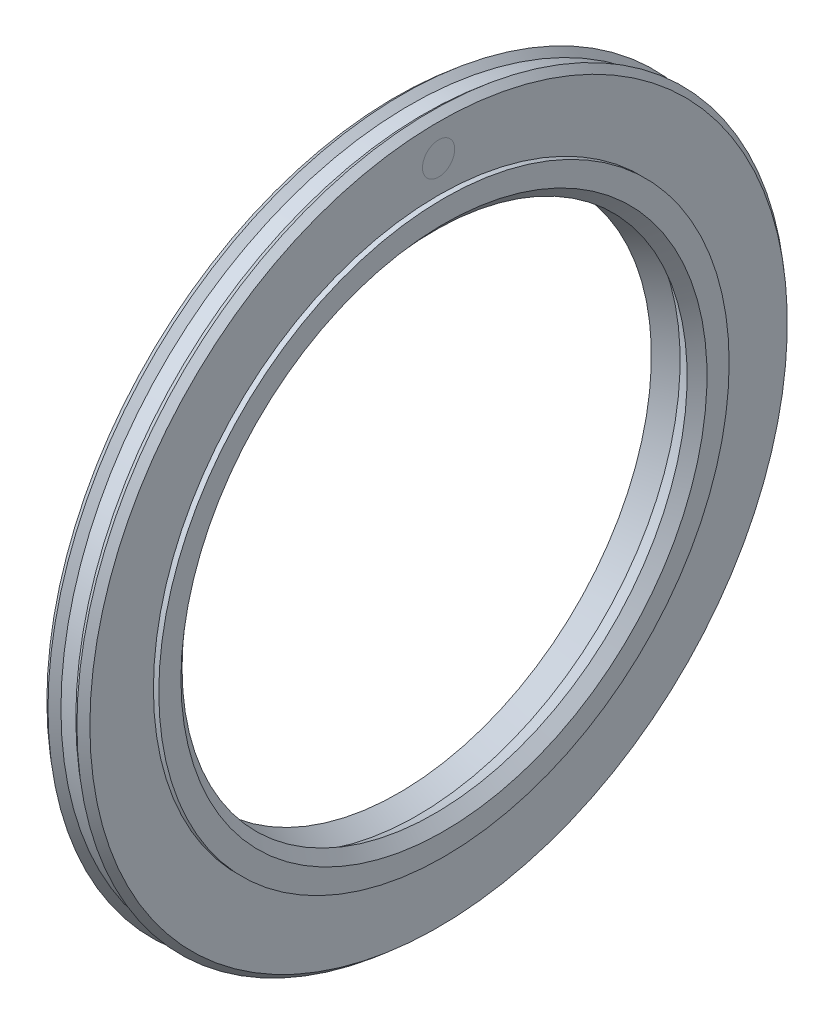
ISO-10303-21;
HEADER;
FILE_DESCRIPTION(('STEP AP214'),'2;1');
FILE_NAME('part.step','',(''),(''),'','','');
FILE_SCHEMA(('AUTOMOTIVE_DESIGN { 1 0 10303 214 1 1 1 1 }'));
ENDSEC;
DATA;
#1=APPLICATION_CONTEXT('core data for automotive mechanical design processes');
#2=APPLICATION_PROTOCOL_DEFINITION('international standard','automotive_design',2000,#1);
#3=PRODUCT_CONTEXT('',#1,'mechanical');
#4=PRODUCT('Part','Part','',(#3));
#5=PRODUCT_RELATED_PRODUCT_CATEGORY('part','',(#4));
#6=PRODUCT_DEFINITION_FORMATION('','',#4);
#7=PRODUCT_DEFINITION_CONTEXT('part definition',#1,'design');
#8=PRODUCT_DEFINITION('design','',#6,#7);
#9=PRODUCT_DEFINITION_SHAPE('','',#8);
#10=(LENGTH_UNIT() NAMED_UNIT(*) SI_UNIT(.MILLI.,.METRE.));
#11=(NAMED_UNIT(*) PLANE_ANGLE_UNIT() SI_UNIT($,.RADIAN.));
#12=(NAMED_UNIT(*) SI_UNIT($,.STERADIAN.) SOLID_ANGLE_UNIT());
#13=UNCERTAINTY_MEASURE_WITH_UNIT(LENGTH_MEASURE(1.E-05),#10,'distance_accuracy_value','');
#14=(GEOMETRIC_REPRESENTATION_CONTEXT(3) GLOBAL_UNCERTAINTY_ASSIGNED_CONTEXT((#13)) GLOBAL_UNIT_ASSIGNED_CONTEXT((#10,
#11,#12)) REPRESENTATION_CONTEXT('',''));
#15=CARTESIAN_POINT('',(0.,0.,0.));
#16=DIRECTION('',(0.,0.,1.));
#17=DIRECTION('',(1.,0.,0.));
#18=AXIS2_PLACEMENT_3D('',#15,#16,#17);
#19=CARTESIAN_POINT('',(4.,32.4496568426294,0.));
#20=DIRECTION('',(-1.,0.,0.));
#21=DIRECTION('',(0.,0.,1.));
#22=AXIS2_PLACEMENT_3D('',#19,#20,#21);
#23=PLANE('',#22);
#24=CARTESIAN_POINT('',(4.,0.,0.));
#25=DIRECTION('',(-1.,0.,0.));
#26=DIRECTION('',(0.,0.,1.));
#27=AXIS2_PLACEMENT_3D('',#24,#25,#26);
#28=CIRCLE('',#27,26.537069046427);
#29=CARTESIAN_POINT('',(4.,0.,26.537069046427));
#30=VERTEX_POINT('',#29);
#31=EDGE_CURVE('E58',#30,#30,#28,.T.);
#32=ORIENTED_EDGE('',*,*,#31,.T.);
#33=EDGE_LOOP('',(#32));
#34=FACE_BOUND('',#33,.T.);
#35=CARTESIAN_POINT('',(4.,0.,0.));
#36=DIRECTION('',(-1.,0.,0.));
#37=DIRECTION('',(0.,0.,1.));
#38=AXIS2_PLACEMENT_3D('',#35,#36,#37);
#39=CIRCLE('',#38,32.4496568426294);
#40=CARTESIAN_POINT('',(4.,0.,32.4496568426294));
#41=VERTEX_POINT('',#40);
#42=EDGE_CURVE('E53',#41,#41,#39,.T.);
#43=ORIENTED_EDGE('',*,*,#42,.F.);
#44=EDGE_LOOP('',(#43));
#45=FACE_BOUND('',#44,.T.);
#46=CARTESIAN_POINT('',(4.,29.4907454905403,0.));
#47=DIRECTION('',(-1.,0.,0.));
#48=DIRECTION('',(0.,0.,1.));
#49=AXIS2_PLACEMENT_3D('',#46,#47,#48);
#50=CIRCLE('',#49,1.5);
#51=CARTESIAN_POINT('',(4.,29.4907454905403,1.5));
#52=VERTEX_POINT('',#51);
#53=EDGE_CURVE('E10',#52,#52,#50,.F.);
#54=ORIENTED_EDGE('',*,*,#53,.F.);
#55=EDGE_LOOP('',(#54));
#56=FACE_BOUND('',#55,.T.);
#57=ADVANCED_FACE('F35',(#34,#45,#56),#23,.F.);
#58=CARTESIAN_POINT('',(0.,0.,0.));
#59=DIRECTION('',(-1.,0.,0.));
#60=DIRECTION('',(0.,0.,1.));
#61=AXIS2_PLACEMENT_3D('',#58,#59,#60);
#62=CYLINDRICAL_SURFACE('',#61,32.4496568426294);
#63=CARTESIAN_POINT('',(1.30757115753417,0.,0.));
#64=DIRECTION('',(-1.,0.,0.));
#65=DIRECTION('',(0.,0.,1.));
#66=AXIS2_PLACEMENT_3D('',#63,#64,#65);
#67=CIRCLE('',#66,32.4496568426294);
#68=CARTESIAN_POINT('',(1.30757115753417,0.,32.4496568426294));
#69=VERTEX_POINT('',#68);
#70=EDGE_CURVE('E91',#69,#69,#67,.T.);
#71=ORIENTED_EDGE('',*,*,#70,.F.);
#72=EDGE_LOOP('',(#71));
#73=FACE_BOUND('',#72,.T.);
#74=CARTESIAN_POINT('',(2.69242884246583,0.,0.));
#75=DIRECTION('',(-1.,0.,0.));
#76=DIRECTION('',(0.,0.,1.));
#77=AXIS2_PLACEMENT_3D('',#74,#75,#76);
#78=CIRCLE('',#77,32.4496568426294);
#79=CARTESIAN_POINT('',(2.69242884246583,0.,32.4496568426294));
#80=VERTEX_POINT('',#79);
#81=EDGE_CURVE('E43',#80,#80,#78,.T.);
#82=ORIENTED_EDGE('',*,*,#81,.T.);
#83=EDGE_LOOP('',(#82));
#84=FACE_BOUND('',#83,.T.);
#85=ADVANCED_FACE('F37',(#73,#84),#62,.T.);
#86=CARTESIAN_POINT('',(3.34621442123292,0.,0.));
#87=DIRECTION('',(1.,0.,0.));
#88=DIRECTION('',(0.,0.,-1.));
#89=AXIS2_PLACEMENT_3D('',#86,#87,#88);
#90=CONICAL_SURFACE('',#89,33.,0.69970211310127);
#91=ORIENTED_EDGE('',*,*,#81,.F.);
#92=EDGE_LOOP('',(#91));
#93=FACE_BOUND('',#92,.T.);
#94=CARTESIAN_POINT('',(3.34621442123292,0.,0.));
#95=DIRECTION('',(-1.,0.,0.));
#96=DIRECTION('',(0.,0.,1.));
#97=AXIS2_PLACEMENT_3D('',#94,#95,#96);
#98=CIRCLE('',#97,33.);
#99=CARTESIAN_POINT('',(3.34621442123292,0.,33.));
#100=VERTEX_POINT('',#99);
#101=EDGE_CURVE('E49',#100,#100,#98,.T.);
#102=ORIENTED_EDGE('',*,*,#101,.T.);
#103=EDGE_LOOP('',(#102));
#104=FACE_BOUND('',#103,.T.);
#105=ADVANCED_FACE('F182',(#93,#104),#90,.T.);
#106=CARTESIAN_POINT('',(4.,0.,0.));
#107=DIRECTION('',(-1.,0.,0.));
#108=DIRECTION('',(0.,0.,1.));
#109=AXIS2_PLACEMENT_3D('',#106,#107,#108);
#110=CONICAL_SURFACE('',#109,32.4496568426294,0.69970211310127);
#111=ORIENTED_EDGE('',*,*,#101,.F.);
#112=EDGE_LOOP('',(#111));
#113=FACE_BOUND('',#112,.T.);
#114=ORIENTED_EDGE('',*,*,#42,.T.);
#115=EDGE_LOOP('',(#114));
#116=FACE_BOUND('',#115,.T.);
#117=ADVANCED_FACE('F187',(#113,#116),#110,.T.);
#118=ORIENTED_EDGE('',*,*,#53,.T.);
#119=EDGE_LOOP('',(#118));
#120=FACE_BOUND('',#119,.T.);
#121=ADVANCED_FACE('F191',(#120),#23,.F.);
#122=CARTESIAN_POINT('',(0.,0.,0.));
#123=DIRECTION('',(-1.,0.,0.));
#124=DIRECTION('',(0.,0.,1.));
#125=AXIS2_PLACEMENT_3D('',#122,#123,#124);
#126=CYLINDRICAL_SURFACE('',#125,26.537069046427);
#127=ORIENTED_EDGE('',*,*,#31,.F.);
#128=EDGE_LOOP('',(#127));
#129=FACE_BOUND('',#128,.T.);
#130=CARTESIAN_POINT('',(4.5,0.,0.));
#131=DIRECTION('',(-1.,0.,0.));
#132=DIRECTION('',(0.,0.,1.));
#133=AXIS2_PLACEMENT_3D('',#130,#131,#132);
#134=CIRCLE('',#133,26.537069046427);
#135=CARTESIAN_POINT('',(4.5,0.,26.537069046427));
#136=VERTEX_POINT('',#135);
#137=EDGE_CURVE('E61',#136,#136,#134,.T.);
#138=ORIENTED_EDGE('',*,*,#137,.T.);
#139=EDGE_LOOP('',(#138));
#140=FACE_BOUND('',#139,.T.);
#141=ADVANCED_FACE('F198',(#129,#140),#126,.T.);
#142=CARTESIAN_POINT('',(4.5,26.537069046427,0.));
#143=DIRECTION('',(-1.,0.,0.));
#144=DIRECTION('',(0.,0.,1.));
#145=AXIS2_PLACEMENT_3D('',#142,#143,#144);
#146=PLANE('',#145);
#147=ORIENTED_EDGE('',*,*,#137,.F.);
#148=EDGE_LOOP('',(#147));
#149=FACE_BOUND('',#148,.T.);
#150=CARTESIAN_POINT('',(4.49999999999998,0.,0.));
#151=DIRECTION('',(-1.,0.,0.));
#152=DIRECTION('',(0.,0.,1.));
#153=AXIS2_PLACEMENT_3D('',#150,#151,#152);
#154=CIRCLE('',#153,24.4758342190069);
#155=CARTESIAN_POINT('',(4.49999999999998,0.,24.4758342190069));
#156=VERTEX_POINT('',#155);
#157=EDGE_CURVE('E64',#156,#156,#154,.T.);
#158=ORIENTED_EDGE('',*,*,#157,.T.);
#159=EDGE_LOOP('',(#158));
#160=FACE_BOUND('',#159,.T.);
#161=ADVANCED_FACE('F203',(#149,#160),#146,.F.);
#162=CARTESIAN_POINT('',(3.62774938475749,0.,0.));
#163=DIRECTION('',(1.,0.,0.));
#164=DIRECTION('',(0.,0.,-1.));
#165=AXIS2_PLACEMENT_3D('',#162,#163,#164);
#166=CONICAL_SURFACE('',#165,23.5,0.841388741457786);
#167=ORIENTED_EDGE('',*,*,#157,.F.);
#168=EDGE_LOOP('',(#167));
#169=FACE_BOUND('',#168,.T.);
#170=CARTESIAN_POINT('',(3.62774938475749,0.,0.));
#171=DIRECTION('',(-1.,0.,0.));
#172=DIRECTION('',(0.,0.,1.));
#173=AXIS2_PLACEMENT_3D('',#170,#171,#172);
#174=CIRCLE('',#173,23.5);
#175=CARTESIAN_POINT('',(3.62774938475749,0.,23.5));
#176=VERTEX_POINT('',#175);
#177=EDGE_CURVE('E67',#176,#176,#174,.T.);
#178=ORIENTED_EDGE('',*,*,#177,.T.);
#179=EDGE_LOOP('',(#178));
#180=FACE_BOUND('',#179,.T.);
#181=ADVANCED_FACE('F254',(#169,#180),#166,.F.);
#182=CARTESIAN_POINT('',(2.,0.,0.));
#183=DIRECTION('',(-1.,0.,0.));
#184=DIRECTION('',(0.,0.,1.));
#185=AXIS2_PLACEMENT_3D('',#182,#183,#184);
#186=CONICAL_SURFACE('',#185,24.4758342190068,0.540051077434647);
#187=ORIENTED_EDGE('',*,*,#177,.F.);
#188=EDGE_LOOP('',(#187));
#189=FACE_BOUND('',#188,.T.);
#190=CARTESIAN_POINT('',(2.,0.,0.));
#191=DIRECTION('',(-1.,0.,0.));
#192=DIRECTION('',(0.,0.,1.));
#193=AXIS2_PLACEMENT_3D('',#190,#191,#192);
#194=CIRCLE('',#193,24.4758342190068);
#195=CARTESIAN_POINT('',(2.,0.,24.4758342190068));
#196=VERTEX_POINT('',#195);
#197=EDGE_CURVE('E70',#196,#196,#194,.T.);
#198=ORIENTED_EDGE('',*,*,#197,.T.);
#199=EDGE_LOOP('',(#198));
#200=FACE_BOUND('',#199,.T.);
#201=ADVANCED_FACE('F263',(#189,#200),#186,.F.);
#202=CARTESIAN_POINT('',(0.300000000000004,0.,0.));
#203=DIRECTION('',(1.,0.,0.));
#204=DIRECTION('',(0.,0.,-1.));
#205=AXIS2_PLACEMENT_3D('',#202,#203,#204);
#206=CONICAL_SURFACE('',#205,23.5,0.521097568812261);
#207=ORIENTED_EDGE('',*,*,#197,.F.);
#208=EDGE_LOOP('',(#207));
#209=FACE_BOUND('',#208,.T.);
#210=CARTESIAN_POINT('',(0.300000000000004,0.,0.));
#211=DIRECTION('',(-1.,0.,0.));
#212=DIRECTION('',(0.,0.,1.));
#213=AXIS2_PLACEMENT_3D('',#210,#211,#212);
#214=CIRCLE('',#213,23.5);
#215=CARTESIAN_POINT('',(0.300000000000004,0.,23.5));
#216=VERTEX_POINT('',#215);
#217=EDGE_CURVE('E73',#216,#216,#214,.T.);
#218=ORIENTED_EDGE('',*,*,#217,.T.);
#219=EDGE_LOOP('',(#218));
#220=FACE_BOUND('',#219,.T.);
#221=ADVANCED_FACE('F272',(#209,#220),#206,.F.);
#222=CARTESIAN_POINT('',(0.500000000000004,0.,0.));
#223=DIRECTION('',(1.,0.,0.));
#224=DIRECTION('',(0.,0.,-1.));
#225=AXIS2_PLACEMENT_3D('',#222,#223,#224);
#226=CONICAL_SURFACE('',#225,24.7933582657414,1.41737531661641);
#227=ORIENTED_EDGE('',*,*,#217,.F.);
#228=EDGE_LOOP('',(#227));
#229=FACE_BOUND('',#228,.T.);
#230=CARTESIAN_POINT('',(0.500000000000004,0.,0.));
#231=DIRECTION('',(-1.,0.,0.));
#232=DIRECTION('',(0.,0.,1.));
#233=AXIS2_PLACEMENT_3D('',#230,#231,#232);
#234=CIRCLE('',#233,24.7933582657414);
#235=CARTESIAN_POINT('',(0.500000000000004,0.,24.7933582657414));
#236=VERTEX_POINT('',#235);
#237=EDGE_CURVE('E76',#236,#236,#234,.T.);
#238=ORIENTED_EDGE('',*,*,#237,.T.);
#239=EDGE_LOOP('',(#238));
#240=FACE_BOUND('',#239,.T.);
#241=ADVANCED_FACE('F281',(#229,#240),#226,.T.);
#242=CARTESIAN_POINT('',(0.500000000000004,26.537069046427,0.));
#243=DIRECTION('',(1.,0.,0.));
#244=DIRECTION('',(0.,0.,-1.));
#245=AXIS2_PLACEMENT_3D('',#242,#243,#244);
#246=PLANE('',#245);
#247=ORIENTED_EDGE('',*,*,#237,.F.);
#248=EDGE_LOOP('',(#247));
#249=FACE_BOUND('',#248,.T.);
#250=CARTESIAN_POINT('',(0.500000000000004,0.,0.));
#251=DIRECTION('',(-1.,0.,0.));
#252=DIRECTION('',(0.,0.,1.));
#253=AXIS2_PLACEMENT_3D('',#250,#251,#252);
#254=CIRCLE('',#253,26.537069046427);
#255=CARTESIAN_POINT('',(0.500000000000004,0.,26.537069046427));
#256=VERTEX_POINT('',#255);
#257=EDGE_CURVE('E79',#256,#256,#254,.T.);
#258=ORIENTED_EDGE('',*,*,#257,.T.);
#259=EDGE_LOOP('',(#258));
#260=FACE_BOUND('',#259,.T.);
#261=ADVANCED_FACE('F290',(#249,#260),#246,.F.);
#262=CARTESIAN_POINT('',(0.,0.,0.));
#263=DIRECTION('',(-1.,0.,0.));
#264=DIRECTION('',(0.,0.,1.));
#265=AXIS2_PLACEMENT_3D('',#262,#263,#264);
#266=CYLINDRICAL_SURFACE('',#265,26.537069046427);
#267=ORIENTED_EDGE('',*,*,#257,.F.);
#268=EDGE_LOOP('',(#267));
#269=FACE_BOUND('',#268,.T.);
#270=CARTESIAN_POINT('',(0.,0.,0.));
#271=DIRECTION('',(-1.,0.,0.));
#272=DIRECTION('',(0.,0.,1.));
#273=AXIS2_PLACEMENT_3D('',#270,#271,#272);
#274=CIRCLE('',#273,26.537069046427);
#275=CARTESIAN_POINT('',(0.,0.,26.537069046427));
#276=VERTEX_POINT('',#275);
#277=EDGE_CURVE('E82',#276,#276,#274,.T.);
#278=ORIENTED_EDGE('',*,*,#277,.T.);
#279=EDGE_LOOP('',(#278));
#280=FACE_BOUND('',#279,.T.);
#281=ADVANCED_FACE('F149',(#269,#280),#266,.F.);
#282=CARTESIAN_POINT('',(0.,32.4496568426294,0.));
#283=DIRECTION('',(1.,0.,0.));
#284=DIRECTION('',(0.,0.,-1.));
#285=AXIS2_PLACEMENT_3D('',#282,#283,#284);
#286=PLANE('',#285);
#287=CARTESIAN_POINT('',(0.,0.,28.));
#288=DIRECTION('',(-1.,0.,0.));
#289=DIRECTION('',(0.,0.,1.));
#290=AXIS2_PLACEMENT_3D('',#287,#288,#289);
#291=CIRCLE('',#290,0.499999999999999);
#292=CARTESIAN_POINT('',(0.,0.,28.5));
#293=VERTEX_POINT('',#292);
#294=EDGE_CURVE('E139',#293,#293,#291,.T.);
#295=ORIENTED_EDGE('',*,*,#294,.F.);
#296=EDGE_LOOP('',(#295));
#297=FACE_BOUND('',#296,.T.);
#298=CARTESIAN_POINT('',(0.,0.,31.));
#299=DIRECTION('',(-1.,0.,0.));
#300=DIRECTION('',(0.,0.,1.));
#301=AXIS2_PLACEMENT_3D('',#298,#299,#300);
#302=CIRCLE('',#301,0.499999999999999);
#303=CARTESIAN_POINT('',(0.,0.,31.5));
#304=VERTEX_POINT('',#303);
#305=EDGE_CURVE('E133',#304,#304,#302,.T.);
#306=ORIENTED_EDGE('',*,*,#305,.F.);
#307=EDGE_LOOP('',(#306));
#308=FACE_BOUND('',#307,.T.);
#309=CARTESIAN_POINT('',(0.,14.7500000000003,-25.5477494116408));
#310=DIRECTION('',(-1.,0.,0.));
#311=DIRECTION('',(0.,0.866025403784433,0.50000000000001));
#312=AXIS2_PLACEMENT_3D('',#309,#310,#311);
#313=CIRCLE('',#312,1.);
#314=CARTESIAN_POINT('',(0.,15.6160254037847,-25.0477494116408));
#315=VERTEX_POINT('',#314);
#316=EDGE_CURVE('E127',#315,#315,#313,.T.);
#317=ORIENTED_EDGE('',*,*,#316,.F.);
#318=EDGE_LOOP('',(#317));
#319=FACE_BOUND('',#318,.T.);
#320=CARTESIAN_POINT('',(0.,-14.7499999999998,-25.5477494116411));
#321=DIRECTION('',(-1.,0.,0.));
#322=DIRECTION('',(0.,0.866025403784443,-0.499999999999992));
#323=AXIS2_PLACEMENT_3D('',#320,#321,#322);
#324=CIRCLE('',#323,1.);
#325=CARTESIAN_POINT('',(0.,-13.8839745962153,-26.0477494116411));
#326=VERTEX_POINT('',#325);
#327=EDGE_CURVE('E121',#326,#326,#324,.T.);
#328=ORIENTED_EDGE('',*,*,#327,.F.);
#329=EDGE_LOOP('',(#328));
#330=FACE_BOUND('',#329,.T.);
#331=CARTESIAN_POINT('',(0.,-29.5,-2.05997518305454E-13));
#332=DIRECTION('',(-1.,0.,0.));
#333=DIRECTION('',(0.,0.,-1.));
#334=AXIS2_PLACEMENT_3D('',#331,#332,#333);
#335=CIRCLE('',#334,1.);
#336=CARTESIAN_POINT('',(0.,-29.5,-1.00000000000021));
#337=VERTEX_POINT('',#336);
#338=EDGE_CURVE('E115',#337,#337,#335,.T.);
#339=ORIENTED_EDGE('',*,*,#338,.F.);
#340=EDGE_LOOP('',(#339));
#341=FACE_BOUND('',#340,.T.);
#342=CARTESIAN_POINT('',(0.,-14.7500000000001,25.5477494116409));
#343=DIRECTION('',(-1.,0.,0.));
#344=DIRECTION('',(0.,-0.866025403784436,-0.500000000000004));
#345=AXIS2_PLACEMENT_3D('',#342,#343,#344);
#346=CIRCLE('',#345,1.);
#347=CARTESIAN_POINT('',(0.,-15.6160254037846,25.0477494116409));
#348=VERTEX_POINT('',#347);
#349=EDGE_CURVE('E109',#348,#348,#346,.T.);
#350=ORIENTED_EDGE('',*,*,#349,.F.);
#351=EDGE_LOOP('',(#350));
#352=FACE_BOUND('',#351,.T.);
#353=CARTESIAN_POINT('',(0.,14.7499999999999,25.547749411641));
#354=DIRECTION('',(-1.,0.,0.));
#355=DIRECTION('',(0.,-0.86602540378444,0.499999999999998));
#356=AXIS2_PLACEMENT_3D('',#353,#354,#355);
#357=CIRCLE('',#356,1.);
#358=CARTESIAN_POINT('',(0.,13.8839745962155,26.047749411641));
#359=VERTEX_POINT('',#358);
#360=EDGE_CURVE('E103',#359,#359,#357,.T.);
#361=ORIENTED_EDGE('',*,*,#360,.F.);
#362=EDGE_LOOP('',(#361));
#363=FACE_BOUND('',#362,.T.);
#364=CARTESIAN_POINT('',(0.,29.5,0.));
#365=DIRECTION('',(-1.,0.,0.));
#366=DIRECTION('',(0.,0.,1.));
#367=AXIS2_PLACEMENT_3D('',#364,#365,#366);
#368=CIRCLE('',#367,1.);
#369=CARTESIAN_POINT('',(0.,29.5,1.));
#370=VERTEX_POINT('',#369);
#371=EDGE_CURVE('E97',#370,#370,#368,.T.);
#372=ORIENTED_EDGE('',*,*,#371,.F.);
#373=EDGE_LOOP('',(#372));
#374=FACE_BOUND('',#373,.T.);
#375=ORIENTED_EDGE('',*,*,#277,.F.);
#376=EDGE_LOOP('',(#375));
#377=FACE_BOUND('',#376,.T.);
#378=CARTESIAN_POINT('',(0.,0.,0.));
#379=DIRECTION('',(-1.,0.,0.));
#380=DIRECTION('',(0.,0.,1.));
#381=AXIS2_PLACEMENT_3D('',#378,#379,#380);
#382=CIRCLE('',#381,32.4496568426294);
#383=CARTESIAN_POINT('',(0.,0.,32.4496568426294));
#384=VERTEX_POINT('',#383);
#385=EDGE_CURVE('E85',#384,#384,#382,.T.);
#386=ORIENTED_EDGE('',*,*,#385,.T.);
#387=EDGE_LOOP('',(#386));
#388=FACE_BOUND('',#387,.T.);
#389=ADVANCED_FACE('F145',(#297,#308,#319,#330,#341,#352,#363,#374,#377,#388),#286,.F.);
#390=CARTESIAN_POINT('',(0.653785578767087,0.,0.));
#391=DIRECTION('',(1.,0.,0.));
#392=DIRECTION('',(0.,0.,-1.));
#393=AXIS2_PLACEMENT_3D('',#390,#391,#392);
#394=CONICAL_SURFACE('',#393,33.,0.69970211310127);
#395=ORIENTED_EDGE('',*,*,#385,.F.);
#396=EDGE_LOOP('',(#395));
#397=FACE_BOUND('',#396,.T.);
#398=CARTESIAN_POINT('',(0.653785578767087,0.,0.));
#399=DIRECTION('',(-1.,0.,0.));
#400=DIRECTION('',(0.,0.,1.));
#401=AXIS2_PLACEMENT_3D('',#398,#399,#400);
#402=CIRCLE('',#401,33.);
#403=CARTESIAN_POINT('',(0.653785578767087,0.,33.));
#404=VERTEX_POINT('',#403);
#405=EDGE_CURVE('E88',#404,#404,#402,.T.);
#406=ORIENTED_EDGE('',*,*,#405,.T.);
#407=EDGE_LOOP('',(#406));
#408=FACE_BOUND('',#407,.T.);
#409=ADVANCED_FACE('F148',(#397,#408),#394,.T.);
#410=CARTESIAN_POINT('',(1.30757115753417,0.,0.));
#411=DIRECTION('',(-1.,0.,0.));
#412=DIRECTION('',(0.,0.,1.));
#413=AXIS2_PLACEMENT_3D('',#410,#411,#412);
#414=CONICAL_SURFACE('',#413,32.4496568426294,0.69970211310127);
#415=ORIENTED_EDGE('',*,*,#405,.F.);
#416=EDGE_LOOP('',(#415));
#417=FACE_BOUND('',#416,.T.);
#418=ORIENTED_EDGE('',*,*,#70,.T.);
#419=EDGE_LOOP('',(#418));
#420=FACE_BOUND('',#419,.T.);
#421=ADVANCED_FACE('F171',(#417,#420),#414,.T.);
#422=CARTESIAN_POINT('',(0.5,29.5,0.));
#423=DIRECTION('',(-1.,0.,0.));
#424=DIRECTION('',(0.,0.,1.));
#425=AXIS2_PLACEMENT_3D('',#422,#423,#424);
#426=CYLINDRICAL_SURFACE('',#425,1.);
#427=CARTESIAN_POINT('',(0.5,29.5,0.));
#428=DIRECTION('',(-1.,0.,0.));
#429=DIRECTION('',(0.,0.,1.));
#430=AXIS2_PLACEMENT_3D('',#427,#428,#429);
#431=CIRCLE('',#430,1.);
#432=CARTESIAN_POINT('',(0.5,29.5,1.));
#433=VERTEX_POINT('',#432);
#434=EDGE_CURVE('E94',#433,#433,#431,.T.);
#435=ORIENTED_EDGE('',*,*,#434,.F.);
#436=EDGE_LOOP('',(#435));
#437=FACE_BOUND('',#436,.T.);
#438=ORIENTED_EDGE('',*,*,#371,.T.);
#439=EDGE_LOOP('',(#438));
#440=FACE_BOUND('',#439,.T.);
#441=ADVANCED_FACE('F177',(#437,#440),#426,.F.);
#442=CARTESIAN_POINT('',(0.5,29.5,0.));
#443=DIRECTION('',(-1.,0.,0.));
#444=DIRECTION('',(0.,0.,1.));
#445=AXIS2_PLACEMENT_3D('',#442,#443,#444);
#446=PLANE('',#445);
#447=ORIENTED_EDGE('',*,*,#434,.T.);
#448=EDGE_LOOP('',(#447));
#449=FACE_BOUND('',#448,.T.);
#450=ADVANCED_FACE('F316',(#449),#446,.T.);
#451=CARTESIAN_POINT('',(0.5,14.7499999999999,25.547749411641));
#452=DIRECTION('',(-1.,0.,0.));
#453=DIRECTION('',(0.,-0.86602540378444,0.499999999999998));
#454=AXIS2_PLACEMENT_3D('',#451,#452,#453);
#455=CYLINDRICAL_SURFACE('',#454,1.);
#456=CARTESIAN_POINT('',(0.5,14.7499999999999,25.547749411641));
#457=DIRECTION('',(-1.,0.,0.));
#458=DIRECTION('',(0.,-0.86602540378444,0.499999999999998));
#459=AXIS2_PLACEMENT_3D('',#456,#457,#458);
#460=CIRCLE('',#459,1.);
#461=CARTESIAN_POINT('',(0.5,13.8839745962155,26.047749411641));
#462=VERTEX_POINT('',#461);
#463=EDGE_CURVE('E100',#462,#462,#460,.T.);
#464=ORIENTED_EDGE('',*,*,#463,.F.);
#465=EDGE_LOOP('',(#464));
#466=FACE_BOUND('',#465,.T.);
#467=ORIENTED_EDGE('',*,*,#360,.T.);
#468=EDGE_LOOP('',(#467));
#469=FACE_BOUND('',#468,.T.);
#470=ADVANCED_FACE('F326',(#466,#469),#455,.F.);
#471=CARTESIAN_POINT('',(0.5,14.7499999999999,25.547749411641));
#472=DIRECTION('',(-1.,0.,0.));
#473=DIRECTION('',(0.,-0.86602540378444,0.499999999999998));
#474=AXIS2_PLACEMENT_3D('',#471,#472,#473);
#475=PLANE('',#474);
#476=ORIENTED_EDGE('',*,*,#463,.T.);
#477=EDGE_LOOP('',(#476));
#478=FACE_BOUND('',#477,.T.);
#479=ADVANCED_FACE('F329',(#478),#475,.T.);
#480=CARTESIAN_POINT('',(0.5,-14.7500000000001,25.5477494116409));
#481=DIRECTION('',(-1.,0.,0.));
#482=DIRECTION('',(0.,-0.866025403784436,-0.500000000000004));
#483=AXIS2_PLACEMENT_3D('',#480,#481,#482);
#484=CYLINDRICAL_SURFACE('',#483,1.);
#485=CARTESIAN_POINT('',(0.5,-14.7500000000001,25.5477494116409));
#486=DIRECTION('',(-1.,0.,0.));
#487=DIRECTION('',(0.,-0.866025403784436,-0.500000000000004));
#488=AXIS2_PLACEMENT_3D('',#485,#486,#487);
#489=CIRCLE('',#488,1.);
#490=CARTESIAN_POINT('',(0.5,-15.6160254037846,25.0477494116409));
#491=VERTEX_POINT('',#490);
#492=EDGE_CURVE('E106',#491,#491,#489,.T.);
#493=ORIENTED_EDGE('',*,*,#492,.F.);
#494=EDGE_LOOP('',(#493));
#495=FACE_BOUND('',#494,.T.);
#496=ORIENTED_EDGE('',*,*,#349,.T.);
#497=EDGE_LOOP('',(#496));
#498=FACE_BOUND('',#497,.T.);
#499=ADVANCED_FACE('F346',(#495,#498),#484,.F.);
#500=CARTESIAN_POINT('',(0.5,-14.7500000000001,25.5477494116409));
#501=DIRECTION('',(-1.,0.,0.));
#502=DIRECTION('',(0.,-0.866025403784436,-0.500000000000004));
#503=AXIS2_PLACEMENT_3D('',#500,#501,#502);
#504=PLANE('',#503);
#505=ORIENTED_EDGE('',*,*,#492,.T.);
#506=EDGE_LOOP('',(#505));
#507=FACE_BOUND('',#506,.T.);
#508=ADVANCED_FACE('F339',(#507),#504,.T.);
#509=CARTESIAN_POINT('',(0.5,-29.5,-2.05997518305454E-13));
#510=DIRECTION('',(-1.,0.,0.));
#511=DIRECTION('',(0.,0.,-1.));
#512=AXIS2_PLACEMENT_3D('',#509,#510,#511);
#513=CYLINDRICAL_SURFACE('',#512,1.);
#514=CARTESIAN_POINT('',(0.5,-29.5,-2.05997518305454E-13));
#515=DIRECTION('',(-1.,0.,0.));
#516=DIRECTION('',(0.,0.,-1.));
#517=AXIS2_PLACEMENT_3D('',#514,#515,#516);
#518=CIRCLE('',#517,1.);
#519=CARTESIAN_POINT('',(0.5,-29.5,-1.00000000000021));
#520=VERTEX_POINT('',#519);
#521=EDGE_CURVE('E112',#520,#520,#518,.T.);
#522=ORIENTED_EDGE('',*,*,#521,.F.);
#523=EDGE_LOOP('',(#522));
#524=FACE_BOUND('',#523,.T.);
#525=ORIENTED_EDGE('',*,*,#338,.T.);
#526=EDGE_LOOP('',(#525));
#527=FACE_BOUND('',#526,.T.);
#528=ADVANCED_FACE('F365',(#524,#527),#513,.F.);
#529=CARTESIAN_POINT('',(0.5,-29.5,-2.05997518305454E-13));
#530=DIRECTION('',(-1.,0.,0.));
#531=DIRECTION('',(0.,0.,-1.));
#532=AXIS2_PLACEMENT_3D('',#529,#530,#531);
#533=PLANE('',#532);
#534=ORIENTED_EDGE('',*,*,#521,.T.);
#535=EDGE_LOOP('',(#534));
#536=FACE_BOUND('',#535,.T.);
#537=ADVANCED_FACE('F358',(#536),#533,.T.);
#538=CARTESIAN_POINT('',(0.5,-14.7499999999998,-25.5477494116411));
#539=DIRECTION('',(-1.,0.,0.));
#540=DIRECTION('',(0.,0.866025403784443,-0.499999999999992));
#541=AXIS2_PLACEMENT_3D('',#538,#539,#540);
#542=CYLINDRICAL_SURFACE('',#541,1.);
#543=CARTESIAN_POINT('',(0.5,-14.7499999999998,-25.5477494116411));
#544=DIRECTION('',(-1.,0.,0.));
#545=DIRECTION('',(0.,0.866025403784443,-0.499999999999992));
#546=AXIS2_PLACEMENT_3D('',#543,#544,#545);
#547=CIRCLE('',#546,1.);
#548=CARTESIAN_POINT('',(0.5,-13.8839745962153,-26.0477494116411));
#549=VERTEX_POINT('',#548);
#550=EDGE_CURVE('E118',#549,#549,#547,.T.);
#551=ORIENTED_EDGE('',*,*,#550,.F.);
#552=EDGE_LOOP('',(#551));
#553=FACE_BOUND('',#552,.T.);
#554=ORIENTED_EDGE('',*,*,#327,.T.);
#555=EDGE_LOOP('',(#554));
#556=FACE_BOUND('',#555,.T.);
#557=ADVANCED_FACE('F384',(#553,#556),#542,.F.);
#558=CARTESIAN_POINT('',(0.5,-14.7499999999998,-25.5477494116411));
#559=DIRECTION('',(-1.,0.,0.));
#560=DIRECTION('',(0.,0.866025403784443,-0.499999999999992));
#561=AXIS2_PLACEMENT_3D('',#558,#559,#560);
#562=PLANE('',#561);
#563=ORIENTED_EDGE('',*,*,#550,.T.);
#564=EDGE_LOOP('',(#563));
#565=FACE_BOUND('',#564,.T.);
#566=ADVANCED_FACE('F377',(#565),#562,.T.);
#567=CARTESIAN_POINT('',(0.5,14.7500000000003,-25.5477494116408));
#568=DIRECTION('',(-1.,0.,0.));
#569=DIRECTION('',(0.,0.866025403784433,0.50000000000001));
#570=AXIS2_PLACEMENT_3D('',#567,#568,#569);
#571=CYLINDRICAL_SURFACE('',#570,1.);
#572=CARTESIAN_POINT('',(0.5,14.7500000000003,-25.5477494116408));
#573=DIRECTION('',(-1.,0.,0.));
#574=DIRECTION('',(0.,0.866025403784433,0.50000000000001));
#575=AXIS2_PLACEMENT_3D('',#572,#573,#574);
#576=CIRCLE('',#575,1.);
#577=CARTESIAN_POINT('',(0.5,15.6160254037847,-25.0477494116408));
#578=VERTEX_POINT('',#577);
#579=EDGE_CURVE('E124',#578,#578,#576,.T.);
#580=ORIENTED_EDGE('',*,*,#579,.F.);
#581=EDGE_LOOP('',(#580));
#582=FACE_BOUND('',#581,.T.);
#583=ORIENTED_EDGE('',*,*,#316,.T.);
#584=EDGE_LOOP('',(#583));
#585=FACE_BOUND('',#584,.T.);
#586=ADVANCED_FACE('F403',(#582,#585),#571,.F.);
#587=CARTESIAN_POINT('',(0.5,14.7500000000003,-25.5477494116408));
#588=DIRECTION('',(-1.,0.,0.));
#589=DIRECTION('',(0.,0.866025403784433,0.50000000000001));
#590=AXIS2_PLACEMENT_3D('',#587,#588,#589);
#591=PLANE('',#590);
#592=ORIENTED_EDGE('',*,*,#579,.T.);
#593=EDGE_LOOP('',(#592));
#594=FACE_BOUND('',#593,.T.);
#595=ADVANCED_FACE('F396',(#594),#591,.T.);
#596=CARTESIAN_POINT('',(0.5,0.,31.));
#597=DIRECTION('',(-1.,0.,0.));
#598=DIRECTION('',(0.,0.,1.));
#599=AXIS2_PLACEMENT_3D('',#596,#597,#598);
#600=CYLINDRICAL_SURFACE('',#599,0.499999999999999);
#601=CARTESIAN_POINT('',(0.5,0.,31.));
#602=DIRECTION('',(-1.,0.,0.));
#603=DIRECTION('',(0.,0.,1.));
#604=AXIS2_PLACEMENT_3D('',#601,#602,#603);
#605=CIRCLE('',#604,0.499999999999999);
#606=CARTESIAN_POINT('',(0.5,0.,31.5));
#607=VERTEX_POINT('',#606);
#608=EDGE_CURVE('E130',#607,#607,#605,.T.);
#609=ORIENTED_EDGE('',*,*,#608,.F.);
#610=EDGE_LOOP('',(#609));
#611=FACE_BOUND('',#610,.T.);
#612=ORIENTED_EDGE('',*,*,#305,.T.);
#613=EDGE_LOOP('',(#612));
#614=FACE_BOUND('',#613,.T.);
#615=ADVANCED_FACE('F415',(#611,#614),#600,.F.);
#616=CARTESIAN_POINT('',(0.5,0.,31.));
#617=DIRECTION('',(-1.,0.,0.));
#618=DIRECTION('',(0.,0.,1.));
#619=AXIS2_PLACEMENT_3D('',#616,#617,#618);
#620=PLANE('',#619);
#621=ORIENTED_EDGE('',*,*,#608,.T.);
#622=EDGE_LOOP('',(#621));
#623=FACE_BOUND('',#622,.T.);
#624=ADVANCED_FACE('F431',(#623),#620,.T.);
#625=CARTESIAN_POINT('',(0.5,0.,28.));
#626=DIRECTION('',(-1.,0.,0.));
#627=DIRECTION('',(0.,0.,1.));
#628=AXIS2_PLACEMENT_3D('',#625,#626,#627);
#629=CYLINDRICAL_SURFACE('',#628,0.499999999999999);
#630=CARTESIAN_POINT('',(0.5,0.,28.));
#631=DIRECTION('',(-1.,0.,0.));
#632=DIRECTION('',(0.,0.,1.));
#633=AXIS2_PLACEMENT_3D('',#630,#631,#632);
#634=CIRCLE('',#633,0.499999999999999);
#635=CARTESIAN_POINT('',(0.5,0.,28.5));
#636=VERTEX_POINT('',#635);
#637=EDGE_CURVE('E136',#636,#636,#634,.T.);
#638=ORIENTED_EDGE('',*,*,#637,.F.);
#639=EDGE_LOOP('',(#638));
#640=FACE_BOUND('',#639,.T.);
#641=ORIENTED_EDGE('',*,*,#294,.T.);
#642=EDGE_LOOP('',(#641));
#643=FACE_BOUND('',#642,.T.);
#644=ADVANCED_FACE('F143',(#640,#643),#629,.F.);
#645=CARTESIAN_POINT('',(0.5,0.,28.));
#646=DIRECTION('',(-1.,0.,0.));
#647=DIRECTION('',(0.,0.,1.));
#648=AXIS2_PLACEMENT_3D('',#645,#646,#647);
#649=PLANE('',#648);
#650=ORIENTED_EDGE('',*,*,#637,.T.);
#651=EDGE_LOOP('',(#650));
#652=FACE_BOUND('',#651,.T.);
#653=ADVANCED_FACE('F449',(#652),#649,.T.);
#654=CLOSED_SHELL('',(#57,#85,#105,#117,#121,#141,#161,#181,#201,#221,#241,#261,#281,#389,#409,
#421,#441,#450,#470,#479,#499,#508,#528,#537,#557,#566,#586,#595,#615,#624,#644,#653));
#655=MANIFOLD_SOLID_BREP('B2',#654);
#656=ADVANCED_BREP_SHAPE_REPRESENTATION('',(#18,#655),#14);
#657=SHAPE_DEFINITION_REPRESENTATION(#9,#656);
ENDSEC;
END-ISO-10303-21;
